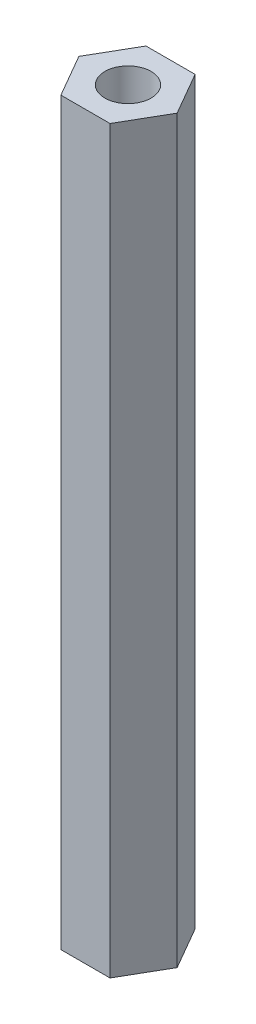
ISO-10303-21;
HEADER;
FILE_DESCRIPTION(('STEP AP214'),'2;1');
FILE_NAME('part.step','',(''),(''),'','','');
FILE_SCHEMA(('AUTOMOTIVE_DESIGN { 1 0 10303 214 1 1 1 1 }'));
ENDSEC;
DATA;
#1=APPLICATION_CONTEXT('core data for automotive mechanical design processes');
#2=APPLICATION_PROTOCOL_DEFINITION('international standard','automotive_design',2000,#1);
#3=PRODUCT_CONTEXT('',#1,'mechanical');
#4=PRODUCT('Part','Part','',(#3));
#5=PRODUCT_RELATED_PRODUCT_CATEGORY('part','',(#4));
#6=PRODUCT_DEFINITION_FORMATION('','',#4);
#7=PRODUCT_DEFINITION_CONTEXT('part definition',#1,'design');
#8=PRODUCT_DEFINITION('design','',#6,#7);
#9=PRODUCT_DEFINITION_SHAPE('','',#8);
#10=(LENGTH_UNIT() NAMED_UNIT(*) SI_UNIT(.MILLI.,.METRE.));
#11=(NAMED_UNIT(*) PLANE_ANGLE_UNIT() SI_UNIT($,.RADIAN.));
#12=(NAMED_UNIT(*) SI_UNIT($,.STERADIAN.) SOLID_ANGLE_UNIT());
#13=UNCERTAINTY_MEASURE_WITH_UNIT(LENGTH_MEASURE(1.E-05),#10,'distance_accuracy_value','');
#14=(GEOMETRIC_REPRESENTATION_CONTEXT(3) GLOBAL_UNCERTAINTY_ASSIGNED_CONTEXT((#13)) GLOBAL_UNIT_ASSIGNED_CONTEXT((#10,
#11,#12)) REPRESENTATION_CONTEXT('',''));
#15=CARTESIAN_POINT('',(0.,0.,0.));
#16=DIRECTION('',(0.,0.,1.));
#17=DIRECTION('',(1.,0.,0.));
#18=AXIS2_PLACEMENT_3D('',#15,#16,#17);
#19=CARTESIAN_POINT('',(-1.32790561913614,20.,2.3));
#20=DIRECTION('',(0.,0.,-1.));
#21=DIRECTION('',(-1.,0.,0.));
#22=AXIS2_PLACEMENT_3D('',#19,#20,#21);
#23=PLANE('',#22);
#24=DIRECTION('',(1.,0.,0.));
#25=VECTOR('',#24,1.);
#26=CARTESIAN_POINT('',(-1.32790561913614,-20.,2.3));
#27=LINE('',#26,#25);
#28=CARTESIAN_POINT('',(-1.32790561913614,-20.,2.3));
#29=VERTEX_POINT('',#28);
#30=CARTESIAN_POINT('',(1.32790561913614,-20.,2.3));
#31=VERTEX_POINT('',#30);
#32=EDGE_CURVE('E121',#29,#31,#27,.T.);
#33=ORIENTED_EDGE('',*,*,#32,.T.);
#34=DIRECTION('',(0.,-1.,0.));
#35=VECTOR('',#34,1.);
#36=CARTESIAN_POINT('',(1.32790561913614,20.,2.3));
#37=LINE('',#36,#35);
#38=CARTESIAN_POINT('',(1.32790561913614,20.,2.3));
#39=VERTEX_POINT('',#38);
#40=EDGE_CURVE('E11',#39,#31,#37,.T.);
#41=ORIENTED_EDGE('',*,*,#40,.F.);
#42=DIRECTION('',(1.,0.,0.));
#43=VECTOR('',#42,1.);
#44=CARTESIAN_POINT('',(-1.32790561913614,20.,2.3));
#45=LINE('',#44,#43);
#46=CARTESIAN_POINT('',(-1.32790561913614,20.,2.3));
#47=VERTEX_POINT('',#46);
#48=EDGE_CURVE('E132',#47,#39,#45,.T.);
#49=ORIENTED_EDGE('',*,*,#48,.F.);
#50=DIRECTION('',(0.,-1.,0.));
#51=VECTOR('',#50,1.);
#52=CARTESIAN_POINT('',(-1.32790561913614,20.,2.3));
#53=LINE('',#52,#51);
#54=EDGE_CURVE('E117',#47,#29,#53,.T.);
#55=ORIENTED_EDGE('',*,*,#54,.T.);
#56=EDGE_LOOP('',(#33,#41,#49,#55));
#57=FACE_BOUND('',#56,.T.);
#58=ADVANCED_FACE('F37',(#57),#23,.F.);
#59=CARTESIAN_POINT('',(1.32790561913614,20.,2.3));
#60=DIRECTION('',(-0.866025403784438,0.,-0.5));
#61=DIRECTION('',(-0.5,0.,0.866025403784439));
#62=AXIS2_PLACEMENT_3D('',#59,#60,#61);
#63=PLANE('',#62);
#64=DIRECTION('',(0.5,0.,-0.866025403784438));
#65=VECTOR('',#64,1.);
#66=CARTESIAN_POINT('',(1.32790561913614,-20.,2.3));
#67=LINE('',#66,#65);
#68=CARTESIAN_POINT('',(2.65581123827228,-20.,0.));
#69=VERTEX_POINT('',#68);
#70=EDGE_CURVE('E124',#31,#69,#67,.T.);
#71=ORIENTED_EDGE('',*,*,#70,.T.);
#72=DIRECTION('',(0.,-1.,0.));
#73=VECTOR('',#72,1.);
#74=CARTESIAN_POINT('',(2.65581123827228,20.,0.));
#75=LINE('',#74,#73);
#76=CARTESIAN_POINT('',(2.65581123827228,20.,0.));
#77=VERTEX_POINT('',#76);
#78=EDGE_CURVE('E45',#77,#69,#75,.T.);
#79=ORIENTED_EDGE('',*,*,#78,.F.);
#80=DIRECTION('',(0.5,0.,-0.866025403784438));
#81=VECTOR('',#80,1.);
#82=CARTESIAN_POINT('',(1.32790561913614,20.,2.3));
#83=LINE('',#82,#81);
#84=EDGE_CURVE('E90',#39,#77,#83,.T.);
#85=ORIENTED_EDGE('',*,*,#84,.F.);
#86=ORIENTED_EDGE('',*,*,#40,.T.);
#87=EDGE_LOOP('',(#71,#79,#85,#86));
#88=FACE_BOUND('',#87,.T.);
#89=ADVANCED_FACE('F157',(#88),#63,.F.);
#90=CARTESIAN_POINT('',(2.65581123827228,20.,0.));
#91=DIRECTION('',(-0.866025403784439,0.,0.5));
#92=DIRECTION('',(0.5,0.,0.866025403784439));
#93=AXIS2_PLACEMENT_3D('',#90,#91,#92);
#94=PLANE('',#93);
#95=DIRECTION('',(-0.5,0.,-0.866025403784439));
#96=VECTOR('',#95,1.);
#97=CARTESIAN_POINT('',(2.65581123827228,-20.,0.));
#98=LINE('',#97,#96);
#99=CARTESIAN_POINT('',(1.32790561913614,-20.,-2.3));
#100=VERTEX_POINT('',#99);
#101=EDGE_CURVE('E127',#69,#100,#98,.T.);
#102=ORIENTED_EDGE('',*,*,#101,.T.);
#103=DIRECTION('',(0.,-1.,0.));
#104=VECTOR('',#103,1.);
#105=CARTESIAN_POINT('',(1.32790561913614,20.,-2.3));
#106=LINE('',#105,#104);
#107=CARTESIAN_POINT('',(1.32790561913614,20.,-2.3));
#108=VERTEX_POINT('',#107);
#109=EDGE_CURVE('E112',#108,#100,#106,.T.);
#110=ORIENTED_EDGE('',*,*,#109,.F.);
#111=DIRECTION('',(-0.5,0.,-0.866025403784439));
#112=VECTOR('',#111,1.);
#113=CARTESIAN_POINT('',(2.65581123827228,20.,0.));
#114=LINE('',#113,#112);
#115=EDGE_CURVE('E103',#77,#108,#114,.T.);
#116=ORIENTED_EDGE('',*,*,#115,.F.);
#117=ORIENTED_EDGE('',*,*,#78,.T.);
#118=EDGE_LOOP('',(#102,#110,#116,#117));
#119=FACE_BOUND('',#118,.T.);
#120=ADVANCED_FACE('F138',(#119),#94,.F.);
#121=CARTESIAN_POINT('',(1.32790561913614,20.,-2.3));
#122=DIRECTION('',(0.,0.,1.));
#123=DIRECTION('',(1.,0.,0.));
#124=AXIS2_PLACEMENT_3D('',#121,#122,#123);
#125=PLANE('',#124);
#126=DIRECTION('',(-1.,0.,0.));
#127=VECTOR('',#126,1.);
#128=CARTESIAN_POINT('',(1.32790561913614,-20.,-2.3));
#129=LINE('',#128,#127);
#130=CARTESIAN_POINT('',(-1.32790561913614,-20.,-2.3));
#131=VERTEX_POINT('',#130);
#132=EDGE_CURVE('E111',#100,#131,#129,.T.);
#133=ORIENTED_EDGE('',*,*,#132,.T.);
#134=DIRECTION('',(0.,-1.,0.));
#135=VECTOR('',#134,1.);
#136=CARTESIAN_POINT('',(-1.32790561913614,20.,-2.3));
#137=LINE('',#136,#135);
#138=CARTESIAN_POINT('',(-1.32790561913614,20.,-2.3));
#139=VERTEX_POINT('',#138);
#140=EDGE_CURVE('E108',#139,#131,#137,.T.);
#141=ORIENTED_EDGE('',*,*,#140,.F.);
#142=DIRECTION('',(-1.,0.,0.));
#143=VECTOR('',#142,1.);
#144=CARTESIAN_POINT('',(1.32790561913614,20.,-2.3));
#145=LINE('',#144,#143);
#146=EDGE_CURVE('E97',#108,#139,#145,.T.);
#147=ORIENTED_EDGE('',*,*,#146,.F.);
#148=ORIENTED_EDGE('',*,*,#109,.T.);
#149=EDGE_LOOP('',(#133,#141,#147,#148));
#150=FACE_BOUND('',#149,.T.);
#151=ADVANCED_FACE('F109',(#150),#125,.F.);
#152=CARTESIAN_POINT('',(-1.32790561913614,20.,-2.3));
#153=DIRECTION('',(0.866025403784439,0.,0.5));
#154=DIRECTION('',(0.5,0.,-0.866025403784439));
#155=AXIS2_PLACEMENT_3D('',#152,#153,#154);
#156=PLANE('',#155);
#157=DIRECTION('',(-0.5,0.,0.866025403784439));
#158=VECTOR('',#157,1.);
#159=CARTESIAN_POINT('',(-1.32790561913614,-20.,-2.3));
#160=LINE('',#159,#158);
#161=CARTESIAN_POINT('',(-2.65581123827228,-20.,0.));
#162=VERTEX_POINT('',#161);
#163=EDGE_CURVE('E76',#131,#162,#160,.T.);
#164=ORIENTED_EDGE('',*,*,#163,.T.);
#165=DIRECTION('',(0.,-1.,0.));
#166=VECTOR('',#165,1.);
#167=CARTESIAN_POINT('',(-2.65581123827228,20.,0.));
#168=LINE('',#167,#166);
#169=CARTESIAN_POINT('',(-2.65581123827228,20.,0.));
#170=VERTEX_POINT('',#169);
#171=EDGE_CURVE('E113',#170,#162,#168,.T.);
#172=ORIENTED_EDGE('',*,*,#171,.F.);
#173=DIRECTION('',(-0.5,0.,0.866025403784439));
#174=VECTOR('',#173,1.);
#175=CARTESIAN_POINT('',(-1.32790561913614,20.,-2.3));
#176=LINE('',#175,#174);
#177=EDGE_CURVE('E101',#139,#170,#176,.T.);
#178=ORIENTED_EDGE('',*,*,#177,.F.);
#179=ORIENTED_EDGE('',*,*,#140,.T.);
#180=EDGE_LOOP('',(#164,#172,#178,#179));
#181=FACE_BOUND('',#180,.T.);
#182=ADVANCED_FACE('F115',(#181),#156,.F.);
#183=CARTESIAN_POINT('',(-2.65581123827228,20.,0.));
#184=DIRECTION('',(0.866025403784439,0.,-0.5));
#185=DIRECTION('',(-0.5,0.,-0.866025403784439));
#186=AXIS2_PLACEMENT_3D('',#183,#184,#185);
#187=PLANE('',#186);
#188=DIRECTION('',(0.5,0.,0.866025403784439));
#189=VECTOR('',#188,1.);
#190=CARTESIAN_POINT('',(-2.65581123827228,-20.,0.));
#191=LINE('',#190,#189);
#192=EDGE_CURVE('E82',#162,#29,#191,.T.);
#193=ORIENTED_EDGE('',*,*,#192,.T.);
#194=ORIENTED_EDGE('',*,*,#54,.F.);
#195=DIRECTION('',(0.5,0.,0.866025403784439));
#196=VECTOR('',#195,1.);
#197=CARTESIAN_POINT('',(-2.65581123827228,20.,0.));
#198=LINE('',#197,#196);
#199=EDGE_CURVE('E53',#170,#47,#198,.T.);
#200=ORIENTED_EDGE('',*,*,#199,.F.);
#201=ORIENTED_EDGE('',*,*,#171,.T.);
#202=EDGE_LOOP('',(#193,#194,#200,#201));
#203=FACE_BOUND('',#202,.T.);
#204=ADVANCED_FACE('F145',(#203),#187,.F.);
#205=CARTESIAN_POINT('',(0.,20.,0.));
#206=DIRECTION('',(0.,1.,0.));
#207=DIRECTION('',(0.,0.,1.));
#208=AXIS2_PLACEMENT_3D('',#205,#206,#207);
#209=PLANE('',#208);
#210=CARTESIAN_POINT('',(0.,20.,0.));
#211=DIRECTION('',(0.,1.,0.));
#212=DIRECTION('',(0.,0.,1.));
#213=AXIS2_PLACEMENT_3D('',#210,#211,#212);
#214=CIRCLE('',#213,1.25);
#215=CARTESIAN_POINT('',(0.,20.,1.25));
#216=VERTEX_POINT('',#215);
#217=EDGE_CURVE('E226',#216,#216,#214,.T.);
#218=ORIENTED_EDGE('',*,*,#217,.F.);
#219=EDGE_LOOP('',(#218));
#220=FACE_BOUND('',#219,.T.);
#221=ORIENTED_EDGE('',*,*,#48,.T.);
#222=ORIENTED_EDGE('',*,*,#84,.T.);
#223=ORIENTED_EDGE('',*,*,#115,.T.);
#224=ORIENTED_EDGE('',*,*,#146,.T.);
#225=ORIENTED_EDGE('',*,*,#177,.T.);
#226=ORIENTED_EDGE('',*,*,#199,.T.);
#227=EDGE_LOOP('',(#221,#222,#223,#224,#225,#226));
#228=FACE_BOUND('',#227,.T.);
#229=ADVANCED_FACE('F99',(#220,#228),#209,.T.);
#230=CARTESIAN_POINT('',(0.,-20.,0.));
#231=DIRECTION('',(0.,1.,0.));
#232=DIRECTION('',(0.,0.,1.));
#233=AXIS2_PLACEMENT_3D('',#230,#231,#232);
#234=PLANE('',#233);
#235=CARTESIAN_POINT('',(0.,-20.,0.));
#236=DIRECTION('',(0.,1.,0.));
#237=DIRECTION('',(0.,0.,1.));
#238=AXIS2_PLACEMENT_3D('',#235,#236,#237);
#239=CIRCLE('',#238,1.25);
#240=CARTESIAN_POINT('',(0.,-20.,1.25));
#241=VERTEX_POINT('',#240);
#242=EDGE_CURVE('E125',#241,#241,#239,.T.);
#243=ORIENTED_EDGE('',*,*,#242,.T.);
#244=EDGE_LOOP('',(#243));
#245=FACE_BOUND('',#244,.T.);
#246=ORIENTED_EDGE('',*,*,#32,.F.);
#247=ORIENTED_EDGE('',*,*,#192,.F.);
#248=ORIENTED_EDGE('',*,*,#163,.F.);
#249=ORIENTED_EDGE('',*,*,#132,.F.);
#250=ORIENTED_EDGE('',*,*,#101,.F.);
#251=ORIENTED_EDGE('',*,*,#70,.F.);
#252=EDGE_LOOP('',(#246,#247,#248,#249,#250,#251));
#253=FACE_BOUND('',#252,.T.);
#254=ADVANCED_FACE('F141',(#245,#253),#234,.F.);
#255=CARTESIAN_POINT('',(0.,20.,0.));
#256=DIRECTION('',(0.,1.,0.));
#257=DIRECTION('',(0.,0.,1.));
#258=AXIS2_PLACEMENT_3D('',#255,#256,#257);
#259=CYLINDRICAL_SURFACE('',#258,1.25);
#260=ORIENTED_EDGE('',*,*,#242,.F.);
#261=EDGE_LOOP('',(#260));
#262=FACE_BOUND('',#261,.T.);
#263=ORIENTED_EDGE('',*,*,#217,.T.);
#264=EDGE_LOOP('',(#263));
#265=FACE_BOUND('',#264,.T.);
#266=ADVANCED_FACE('F194',(#262,#265),#259,.F.);
#267=CLOSED_SHELL('',(#58,#89,#120,#151,#182,#204,#229,#254,#266));
#268=MANIFOLD_SOLID_BREP('B2',#267);
#269=ADVANCED_BREP_SHAPE_REPRESENTATION('',(#18,#268),#14);
#270=SHAPE_DEFINITION_REPRESENTATION(#9,#269);
ENDSEC;
END-ISO-10303-21;
